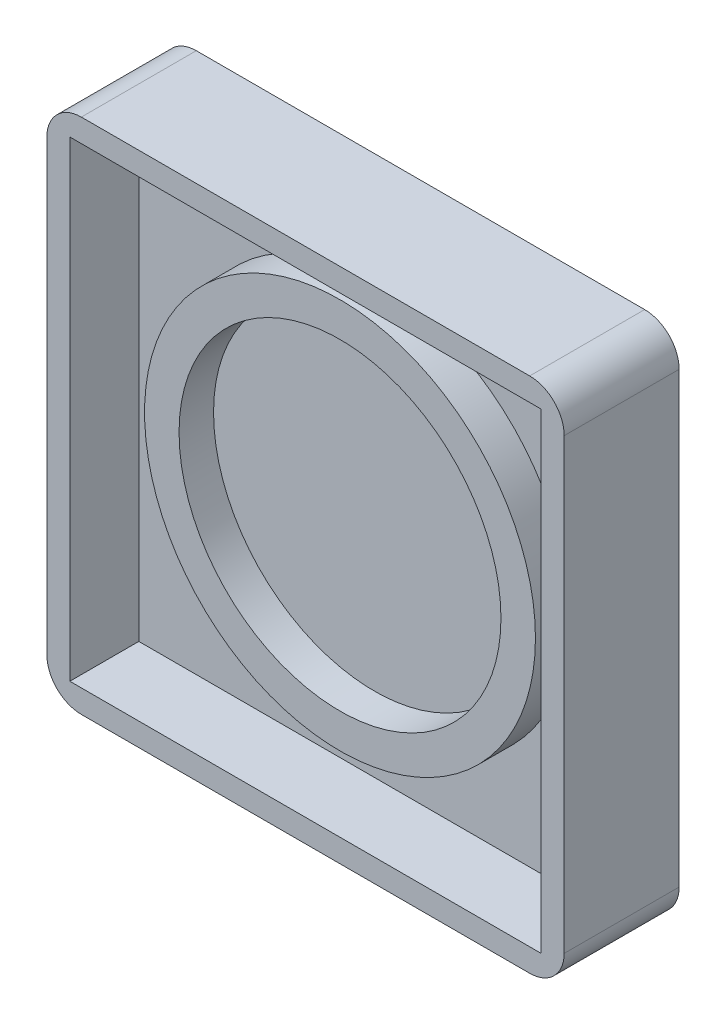
ISO-10303-21;
HEADER;
FILE_DESCRIPTION(('STEP AP214'),'2;1');
FILE_NAME('part.step','',(''),(''),'','','');
FILE_SCHEMA(('AUTOMOTIVE_DESIGN { 1 0 10303 214 1 1 1 1 }'));
ENDSEC;
DATA;
#1=APPLICATION_CONTEXT('core data for automotive mechanical design processes');
#2=APPLICATION_PROTOCOL_DEFINITION('international standard','automotive_design',2000,#1);
#3=PRODUCT_CONTEXT('',#1,'mechanical');
#4=PRODUCT('Part','Part','',(#3));
#5=PRODUCT_RELATED_PRODUCT_CATEGORY('part','',(#4));
#6=PRODUCT_DEFINITION_FORMATION('','',#4);
#7=PRODUCT_DEFINITION_CONTEXT('part definition',#1,'design');
#8=PRODUCT_DEFINITION('design','',#6,#7);
#9=PRODUCT_DEFINITION_SHAPE('','',#8);
#10=(LENGTH_UNIT() NAMED_UNIT(*) SI_UNIT(.MILLI.,.METRE.));
#11=(NAMED_UNIT(*) PLANE_ANGLE_UNIT() SI_UNIT($,.RADIAN.));
#12=(NAMED_UNIT(*) SI_UNIT($,.STERADIAN.) SOLID_ANGLE_UNIT());
#13=UNCERTAINTY_MEASURE_WITH_UNIT(LENGTH_MEASURE(1.E-05),#10,'distance_accuracy_value','');
#14=(GEOMETRIC_REPRESENTATION_CONTEXT(3) GLOBAL_UNCERTAINTY_ASSIGNED_CONTEXT((#13)) GLOBAL_UNIT_ASSIGNED_CONTEXT((#10,
#11,#12)) REPRESENTATION_CONTEXT('',''));
#15=CARTESIAN_POINT('',(0.,0.,0.));
#16=DIRECTION('',(0.,0.,1.));
#17=DIRECTION('',(1.,0.,0.));
#18=AXIS2_PLACEMENT_3D('',#15,#16,#17);
#19=CARTESIAN_POINT('',(-22.5,-22.5,10.));
#20=DIRECTION('',(1.,0.,0.));
#21=DIRECTION('',(0.,0.,-1.));
#22=AXIS2_PLACEMENT_3D('',#19,#20,#21);
#23=PLANE('',#22);
#24=DIRECTION('',(0.,-1.,0.));
#25=VECTOR('',#24,1.);
#26=CARTESIAN_POINT('',(-22.5,-22.5,0.));
#27=LINE('',#26,#25);
#28=CARTESIAN_POINT('',(-22.5,19.5,0.));
#29=VERTEX_POINT('',#28);
#30=CARTESIAN_POINT('',(-22.5,-19.5,0.));
#31=VERTEX_POINT('',#30);
#32=EDGE_CURVE('E165',#29,#31,#27,.T.);
#33=ORIENTED_EDGE('',*,*,#32,.T.);
#34=DIRECTION('',(0.,0.,-1.));
#35=VECTOR('',#34,1.);
#36=CARTESIAN_POINT('',(-22.5,-19.5,10.));
#37=LINE('',#36,#35);
#38=CARTESIAN_POINT('',(-22.5,-19.5,10.));
#39=VERTEX_POINT('',#38);
#40=EDGE_CURVE('E208',#31,#39,#37,.F.);
#41=ORIENTED_EDGE('',*,*,#40,.T.);
#42=DIRECTION('',(0.,-1.,0.));
#43=VECTOR('',#42,1.);
#44=CARTESIAN_POINT('',(-22.5,-22.5,10.));
#45=LINE('',#44,#43);
#46=CARTESIAN_POINT('',(-22.5,19.5,10.));
#47=VERTEX_POINT('',#46);
#48=EDGE_CURVE('E169',#47,#39,#45,.T.);
#49=ORIENTED_EDGE('',*,*,#48,.F.);
#50=DIRECTION('',(0.,0.,-1.));
#51=VECTOR('',#50,1.);
#52=CARTESIAN_POINT('',(-22.5,19.5,10.));
#53=LINE('',#52,#51);
#54=EDGE_CURVE('E205',#47,#29,#53,.T.);
#55=ORIENTED_EDGE('',*,*,#54,.T.);
#56=EDGE_LOOP('',(#33,#41,#49,#55));
#57=FACE_BOUND('',#56,.T.);
#58=ADVANCED_FACE('F33',(#57),#23,.F.);
#59=CARTESIAN_POINT('',(22.5,-22.5,10.));
#60=DIRECTION('',(0.,1.,0.));
#61=DIRECTION('',(-1.,0.,0.));
#62=AXIS2_PLACEMENT_3D('',#59,#60,#61);
#63=PLANE('',#62);
#64=DIRECTION('',(1.,0.,0.));
#65=VECTOR('',#64,1.);
#66=CARTESIAN_POINT('',(22.5,-22.5,10.));
#67=LINE('',#66,#65);
#68=CARTESIAN_POINT('',(-19.5,-22.5,10.));
#69=VERTEX_POINT('',#68);
#70=CARTESIAN_POINT('',(19.5,-22.5,10.));
#71=VERTEX_POINT('',#70);
#72=EDGE_CURVE('E172',#69,#71,#67,.T.);
#73=ORIENTED_EDGE('',*,*,#72,.F.);
#74=DIRECTION('',(0.,0.,-1.));
#75=VECTOR('',#74,1.);
#76=CARTESIAN_POINT('',(-19.5,-22.5,10.));
#77=LINE('',#76,#75);
#78=CARTESIAN_POINT('',(-19.5,-22.5,0.));
#79=VERTEX_POINT('',#78);
#80=EDGE_CURVE('E194',#69,#79,#77,.T.);
#81=ORIENTED_EDGE('',*,*,#80,.T.);
#82=DIRECTION('',(1.,0.,0.));
#83=VECTOR('',#82,1.);
#84=CARTESIAN_POINT('',(22.5,-22.5,0.));
#85=LINE('',#84,#83);
#86=CARTESIAN_POINT('',(19.5,-22.5,0.));
#87=VERTEX_POINT('',#86);
#88=EDGE_CURVE('E183',#79,#87,#85,.T.);
#89=ORIENTED_EDGE('',*,*,#88,.T.);
#90=DIRECTION('',(0.,0.,-1.));
#91=VECTOR('',#90,1.);
#92=CARTESIAN_POINT('',(19.5,-22.5,10.));
#93=LINE('',#92,#91);
#94=EDGE_CURVE('E192',#87,#71,#93,.F.);
#95=ORIENTED_EDGE('',*,*,#94,.T.);
#96=EDGE_LOOP('',(#73,#81,#89,#95));
#97=FACE_BOUND('',#96,.T.);
#98=ADVANCED_FACE('F245',(#97),#63,.F.);
#99=CARTESIAN_POINT('',(22.5,-22.5,10.));
#100=DIRECTION('',(-1.,0.,0.));
#101=DIRECTION('',(0.,0.,1.));
#102=AXIS2_PLACEMENT_3D('',#99,#100,#101);
#103=PLANE('',#102);
#104=DIRECTION('',(0.,1.,0.));
#105=VECTOR('',#104,1.);
#106=CARTESIAN_POINT('',(22.5,-22.5,10.));
#107=LINE('',#106,#105);
#108=CARTESIAN_POINT('',(22.5,-19.5,10.));
#109=VERTEX_POINT('',#108);
#110=CARTESIAN_POINT('',(22.5,19.5,10.));
#111=VERTEX_POINT('',#110);
#112=EDGE_CURVE('E176',#109,#111,#107,.T.);
#113=ORIENTED_EDGE('',*,*,#112,.F.);
#114=DIRECTION('',(0.,0.,-1.));
#115=VECTOR('',#114,1.);
#116=CARTESIAN_POINT('',(22.5,-19.5,10.));
#117=LINE('',#116,#115);
#118=CARTESIAN_POINT('',(22.5,-19.5,0.));
#119=VERTEX_POINT('',#118);
#120=EDGE_CURVE('E219',#109,#119,#117,.T.);
#121=ORIENTED_EDGE('',*,*,#120,.T.);
#122=DIRECTION('',(0.,1.,0.));
#123=VECTOR('',#122,1.);
#124=CARTESIAN_POINT('',(22.5,-22.5,0.));
#125=LINE('',#124,#123);
#126=CARTESIAN_POINT('',(22.5,19.5,0.));
#127=VERTEX_POINT('',#126);
#128=EDGE_CURVE('E186',#119,#127,#125,.T.);
#129=ORIENTED_EDGE('',*,*,#128,.T.);
#130=DIRECTION('',(0.,0.,-1.));
#131=VECTOR('',#130,1.);
#132=CARTESIAN_POINT('',(22.5,19.5,10.));
#133=LINE('',#132,#131);
#134=EDGE_CURVE('E217',#127,#111,#133,.F.);
#135=ORIENTED_EDGE('',*,*,#134,.T.);
#136=EDGE_LOOP('',(#113,#121,#129,#135));
#137=FACE_BOUND('',#136,.T.);
#138=ADVANCED_FACE('F253',(#137),#103,.F.);
#139=CARTESIAN_POINT('',(22.5,22.5,10.));
#140=DIRECTION('',(0.,-1.,0.));
#141=DIRECTION('',(1.,0.,0.));
#142=AXIS2_PLACEMENT_3D('',#139,#140,#141);
#143=PLANE('',#142);
#144=DIRECTION('',(-1.,0.,0.));
#145=VECTOR('',#144,1.);
#146=CARTESIAN_POINT('',(22.5,22.5,0.));
#147=LINE('',#146,#145);
#148=CARTESIAN_POINT('',(19.5,22.5,0.));
#149=VERTEX_POINT('',#148);
#150=CARTESIAN_POINT('',(-19.5,22.5,0.));
#151=VERTEX_POINT('',#150);
#152=EDGE_CURVE('E173',#149,#151,#147,.T.);
#153=ORIENTED_EDGE('',*,*,#152,.T.);
#154=DIRECTION('',(0.,0.,-1.));
#155=VECTOR('',#154,1.);
#156=CARTESIAN_POINT('',(-19.5,22.5,10.));
#157=LINE('',#156,#155);
#158=CARTESIAN_POINT('',(-19.5,22.5,10.));
#159=VERTEX_POINT('',#158);
#160=EDGE_CURVE('E11',#151,#159,#157,.F.);
#161=ORIENTED_EDGE('',*,*,#160,.T.);
#162=DIRECTION('',(-1.,0.,0.));
#163=VECTOR('',#162,1.);
#164=CARTESIAN_POINT('',(22.5,22.5,10.));
#165=LINE('',#164,#163);
#166=CARTESIAN_POINT('',(19.5,22.5,10.));
#167=VERTEX_POINT('',#166);
#168=EDGE_CURVE('E178',#167,#159,#165,.T.);
#169=ORIENTED_EDGE('',*,*,#168,.F.);
#170=DIRECTION('',(0.,0.,-1.));
#171=VECTOR('',#170,1.);
#172=CARTESIAN_POINT('',(19.5,22.5,10.));
#173=LINE('',#172,#171);
#174=EDGE_CURVE('E41',#167,#149,#173,.T.);
#175=ORIENTED_EDGE('',*,*,#174,.T.);
#176=EDGE_LOOP('',(#153,#161,#169,#175));
#177=FACE_BOUND('',#176,.T.);
#178=ADVANCED_FACE('F224',(#177),#143,.F.);
#179=CARTESIAN_POINT('',(0.,0.,10.));
#180=DIRECTION('',(0.,0.,1.));
#181=DIRECTION('',(1.,0.,0.));
#182=AXIS2_PLACEMENT_3D('',#179,#180,#181);
#183=PLANE('',#182);
#184=DIRECTION('',(0.,-1.,0.));
#185=VECTOR('',#184,1.);
#186=CARTESIAN_POINT('',(-20.5,-20.5,10.));
#187=LINE('',#186,#185);
#188=CARTESIAN_POINT('',(-20.5,20.5,10.));
#189=VERTEX_POINT('',#188);
#190=CARTESIAN_POINT('',(-20.5,-20.5,10.));
#191=VERTEX_POINT('',#190);
#192=EDGE_CURVE('E129',#189,#191,#187,.T.);
#193=ORIENTED_EDGE('',*,*,#192,.F.);
#194=DIRECTION('',(-1.,0.,0.));
#195=VECTOR('',#194,1.);
#196=CARTESIAN_POINT('',(20.5,20.5,10.));
#197=LINE('',#196,#195);
#198=CARTESIAN_POINT('',(20.5,20.5,10.));
#199=VERTEX_POINT('',#198);
#200=EDGE_CURVE('E146',#199,#189,#197,.T.);
#201=ORIENTED_EDGE('',*,*,#200,.F.);
#202=DIRECTION('',(0.,1.,0.));
#203=VECTOR('',#202,1.);
#204=CARTESIAN_POINT('',(20.5,-20.5,10.));
#205=LINE('',#204,#203);
#206=CARTESIAN_POINT('',(20.5,-20.5,10.));
#207=VERTEX_POINT('',#206);
#208=EDGE_CURVE('E149',#207,#199,#205,.T.);
#209=ORIENTED_EDGE('',*,*,#208,.F.);
#210=DIRECTION('',(1.,0.,0.));
#211=VECTOR('',#210,1.);
#212=CARTESIAN_POINT('',(20.5,-20.5,10.));
#213=LINE('',#212,#211);
#214=EDGE_CURVE('E158',#191,#207,#213,.T.);
#215=ORIENTED_EDGE('',*,*,#214,.F.);
#216=EDGE_LOOP('',(#193,#201,#209,#215));
#217=FACE_BOUND('',#216,.T.);
#218=ORIENTED_EDGE('',*,*,#48,.T.);
#219=CARTESIAN_POINT('',(-19.5,-19.5,10.));
#220=DIRECTION('',(0.,0.,1.));
#221=DIRECTION('',(1.,0.,0.));
#222=AXIS2_PLACEMENT_3D('',#219,#220,#221);
#223=CIRCLE('',#222,3.);
#224=EDGE_CURVE('E215',#39,#69,#223,.T.);
#225=ORIENTED_EDGE('',*,*,#224,.T.);
#226=ORIENTED_EDGE('',*,*,#72,.T.);
#227=CARTESIAN_POINT('',(19.5,-19.5,10.));
#228=DIRECTION('',(0.,0.,1.));
#229=DIRECTION('',(1.,0.,0.));
#230=AXIS2_PLACEMENT_3D('',#227,#228,#229);
#231=CIRCLE('',#230,3.);
#232=EDGE_CURVE('E213',#71,#109,#231,.T.);
#233=ORIENTED_EDGE('',*,*,#232,.T.);
#234=ORIENTED_EDGE('',*,*,#112,.T.);
#235=CARTESIAN_POINT('',(19.5,19.5,10.));
#236=DIRECTION('',(0.,0.,1.));
#237=DIRECTION('',(1.,0.,0.));
#238=AXIS2_PLACEMENT_3D('',#235,#236,#237);
#239=CIRCLE('',#238,3.);
#240=EDGE_CURVE('E53',#111,#167,#239,.T.);
#241=ORIENTED_EDGE('',*,*,#240,.T.);
#242=ORIENTED_EDGE('',*,*,#168,.T.);
#243=CARTESIAN_POINT('',(-19.5,19.5,10.));
#244=DIRECTION('',(0.,0.,1.));
#245=DIRECTION('',(1.,0.,0.));
#246=AXIS2_PLACEMENT_3D('',#243,#244,#245);
#247=CIRCLE('',#246,3.);
#248=EDGE_CURVE('E211',#159,#47,#247,.T.);
#249=ORIENTED_EDGE('',*,*,#248,.T.);
#250=EDGE_LOOP('',(#218,#225,#226,#233,#234,#241,#242,#249));
#251=FACE_BOUND('',#250,.T.);
#252=ADVANCED_FACE('F239',(#217,#251),#183,.T.);
#253=CARTESIAN_POINT('',(0.,0.,0.));
#254=DIRECTION('',(0.,0.,1.));
#255=DIRECTION('',(1.,0.,0.));
#256=AXIS2_PLACEMENT_3D('',#253,#254,#255);
#257=PLANE('',#256);
#258=ORIENTED_EDGE('',*,*,#88,.F.);
#259=CARTESIAN_POINT('',(-19.5,-19.5,0.));
#260=DIRECTION('',(0.,0.,1.));
#261=DIRECTION('',(1.,0.,0.));
#262=AXIS2_PLACEMENT_3D('',#259,#260,#261);
#263=CIRCLE('',#262,3.);
#264=EDGE_CURVE('E203',#79,#31,#263,.F.);
#265=ORIENTED_EDGE('',*,*,#264,.T.);
#266=ORIENTED_EDGE('',*,*,#32,.F.);
#267=CARTESIAN_POINT('',(-19.5,19.5,0.));
#268=DIRECTION('',(0.,0.,1.));
#269=DIRECTION('',(1.,0.,0.));
#270=AXIS2_PLACEMENT_3D('',#267,#268,#269);
#271=CIRCLE('',#270,3.);
#272=EDGE_CURVE('E199',#29,#151,#271,.F.);
#273=ORIENTED_EDGE('',*,*,#272,.T.);
#274=ORIENTED_EDGE('',*,*,#152,.F.);
#275=CARTESIAN_POINT('',(19.5,19.5,0.));
#276=DIRECTION('',(0.,0.,1.));
#277=DIRECTION('',(1.,0.,0.));
#278=AXIS2_PLACEMENT_3D('',#275,#276,#277);
#279=CIRCLE('',#278,3.);
#280=EDGE_CURVE('E197',#149,#127,#279,.F.);
#281=ORIENTED_EDGE('',*,*,#280,.T.);
#282=ORIENTED_EDGE('',*,*,#128,.F.);
#283=CARTESIAN_POINT('',(19.5,-19.5,0.));
#284=DIRECTION('',(0.,0.,1.));
#285=DIRECTION('',(1.,0.,0.));
#286=AXIS2_PLACEMENT_3D('',#283,#284,#285);
#287=CIRCLE('',#286,3.);
#288=EDGE_CURVE('E201',#119,#87,#287,.F.);
#289=ORIENTED_EDGE('',*,*,#288,.T.);
#290=EDGE_LOOP('',(#258,#265,#266,#273,#274,#281,#282,#289));
#291=FACE_BOUND('',#290,.T.);
#292=ADVANCED_FACE('F228',(#291),#257,.F.);
#293=CARTESIAN_POINT('',(-20.5,-20.5,4.));
#294=DIRECTION('',(-1.,0.,0.));
#295=DIRECTION('',(0.,0.,1.));
#296=AXIS2_PLACEMENT_3D('',#293,#294,#295);
#297=PLANE('',#296);
#298=ORIENTED_EDGE('',*,*,#192,.T.);
#299=DIRECTION('',(0.,0.,1.));
#300=VECTOR('',#299,1.);
#301=CARTESIAN_POINT('',(-20.5,-20.5,4.));
#302=LINE('',#301,#300);
#303=CARTESIAN_POINT('',(-20.5,-20.5,4.));
#304=VERTEX_POINT('',#303);
#305=EDGE_CURVE('E122',#304,#191,#302,.T.);
#306=ORIENTED_EDGE('',*,*,#305,.F.);
#307=DIRECTION('',(0.,-1.,0.));
#308=VECTOR('',#307,1.);
#309=CARTESIAN_POINT('',(-20.5,-20.5,4.));
#310=LINE('',#309,#308);
#311=CARTESIAN_POINT('',(-20.5,20.5,4.));
#312=VERTEX_POINT('',#311);
#313=EDGE_CURVE('E126',#312,#304,#310,.T.);
#314=ORIENTED_EDGE('',*,*,#313,.F.);
#315=DIRECTION('',(0.,0.,1.));
#316=VECTOR('',#315,1.);
#317=CARTESIAN_POINT('',(-20.5,20.5,4.));
#318=LINE('',#317,#316);
#319=EDGE_CURVE('E163',#312,#189,#318,.T.);
#320=ORIENTED_EDGE('',*,*,#319,.T.);
#321=EDGE_LOOP('',(#298,#306,#314,#320));
#322=FACE_BOUND('',#321,.T.);
#323=ADVANCED_FACE('F124',(#322),#297,.F.);
#324=CARTESIAN_POINT('',(20.5,20.5,4.));
#325=DIRECTION('',(0.,1.,0.));
#326=DIRECTION('',(-1.,0.,0.));
#327=AXIS2_PLACEMENT_3D('',#324,#325,#326);
#328=PLANE('',#327);
#329=ORIENTED_EDGE('',*,*,#200,.T.);
#330=ORIENTED_EDGE('',*,*,#319,.F.);
#331=DIRECTION('',(-1.,0.,0.));
#332=VECTOR('',#331,1.);
#333=CARTESIAN_POINT('',(20.5,20.5,4.));
#334=LINE('',#333,#332);
#335=CARTESIAN_POINT('',(20.5,20.5,4.));
#336=VERTEX_POINT('',#335);
#337=EDGE_CURVE('E134',#336,#312,#334,.T.);
#338=ORIENTED_EDGE('',*,*,#337,.F.);
#339=DIRECTION('',(0.,0.,1.));
#340=VECTOR('',#339,1.);
#341=CARTESIAN_POINT('',(20.5,20.5,4.));
#342=LINE('',#341,#340);
#343=EDGE_CURVE('E166',#336,#199,#342,.T.);
#344=ORIENTED_EDGE('',*,*,#343,.T.);
#345=EDGE_LOOP('',(#329,#330,#338,#344));
#346=FACE_BOUND('',#345,.T.);
#347=ADVANCED_FACE('F350',(#346),#328,.F.);
#348=CARTESIAN_POINT('',(20.5,-20.5,4.));
#349=DIRECTION('',(1.,0.,0.));
#350=DIRECTION('',(0.,0.,-1.));
#351=AXIS2_PLACEMENT_3D('',#348,#349,#350);
#352=PLANE('',#351);
#353=ORIENTED_EDGE('',*,*,#208,.T.);
#354=ORIENTED_EDGE('',*,*,#343,.F.);
#355=DIRECTION('',(0.,1.,0.));
#356=VECTOR('',#355,1.);
#357=CARTESIAN_POINT('',(20.5,-20.5,4.));
#358=LINE('',#357,#356);
#359=CARTESIAN_POINT('',(20.5,-20.5,4.));
#360=VERTEX_POINT('',#359);
#361=EDGE_CURVE('E142',#360,#336,#358,.T.);
#362=ORIENTED_EDGE('',*,*,#361,.F.);
#363=DIRECTION('',(0.,0.,1.));
#364=VECTOR('',#363,1.);
#365=CARTESIAN_POINT('',(20.5,-20.5,4.));
#366=LINE('',#365,#364);
#367=EDGE_CURVE('E133',#360,#207,#366,.T.);
#368=ORIENTED_EDGE('',*,*,#367,.T.);
#369=EDGE_LOOP('',(#353,#354,#362,#368));
#370=FACE_BOUND('',#369,.T.);
#371=ADVANCED_FACE('F342',(#370),#352,.F.);
#372=CARTESIAN_POINT('',(20.5,-20.5,4.));
#373=DIRECTION('',(0.,-1.,0.));
#374=DIRECTION('',(1.,0.,0.));
#375=AXIS2_PLACEMENT_3D('',#372,#373,#374);
#376=PLANE('',#375);
#377=ORIENTED_EDGE('',*,*,#214,.T.);
#378=ORIENTED_EDGE('',*,*,#367,.F.);
#379=DIRECTION('',(1.,0.,0.));
#380=VECTOR('',#379,1.);
#381=CARTESIAN_POINT('',(20.5,-20.5,4.));
#382=LINE('',#381,#380);
#383=EDGE_CURVE('E137',#304,#360,#382,.T.);
#384=ORIENTED_EDGE('',*,*,#383,.F.);
#385=ORIENTED_EDGE('',*,*,#305,.T.);
#386=EDGE_LOOP('',(#377,#378,#384,#385));
#387=FACE_BOUND('',#386,.T.);
#388=ADVANCED_FACE('F138',(#387),#376,.F.);
#389=CARTESIAN_POINT('',(0.,0.,4.));
#390=DIRECTION('',(0.,0.,1.));
#391=DIRECTION('',(1.,0.,0.));
#392=AXIS2_PLACEMENT_3D('',#389,#390,#391);
#393=PLANE('',#392);
#394=CARTESIAN_POINT('',(0.,0.,4.));
#395=DIRECTION('',(0.,0.,1.));
#396=DIRECTION('',(1.,0.,0.));
#397=AXIS2_PLACEMENT_3D('',#394,#395,#396);
#398=CIRCLE('',#397,17.);
#399=CARTESIAN_POINT('',(17.,0.,4.));
#400=VERTEX_POINT('',#399);
#401=EDGE_CURVE('E152',#400,#400,#398,.T.);
#402=ORIENTED_EDGE('',*,*,#401,.F.);
#403=EDGE_LOOP('',(#402));
#404=FACE_BOUND('',#403,.T.);
#405=ORIENTED_EDGE('',*,*,#313,.T.);
#406=ORIENTED_EDGE('',*,*,#383,.T.);
#407=ORIENTED_EDGE('',*,*,#361,.T.);
#408=ORIENTED_EDGE('',*,*,#337,.T.);
#409=EDGE_LOOP('',(#405,#406,#407,#408));
#410=FACE_BOUND('',#409,.T.);
#411=ADVANCED_FACE('F144',(#404,#410),#393,.T.);
#412=CARTESIAN_POINT('',(0.,0.,7.));
#413=DIRECTION('',(0.,0.,1.));
#414=DIRECTION('',(1.,0.,0.));
#415=AXIS2_PLACEMENT_3D('',#412,#413,#414);
#416=PLANE('',#415);
#417=CARTESIAN_POINT('',(0.,0.,7.));
#418=DIRECTION('',(0.,0.,1.));
#419=DIRECTION('',(1.,0.,0.));
#420=AXIS2_PLACEMENT_3D('',#417,#418,#419);
#421=CIRCLE('',#420,17.);
#422=CARTESIAN_POINT('',(17.,0.,7.));
#423=VERTEX_POINT('',#422);
#424=EDGE_CURVE('E159',#423,#423,#421,.T.);
#425=ORIENTED_EDGE('',*,*,#424,.T.);
#426=EDGE_LOOP('',(#425));
#427=FACE_BOUND('',#426,.T.);
#428=CARTESIAN_POINT('',(0.,0.,7.));
#429=DIRECTION('',(0.,0.,1.));
#430=DIRECTION('',(1.,0.,0.));
#431=AXIS2_PLACEMENT_3D('',#428,#429,#430);
#432=CIRCLE('',#431,14.);
#433=CARTESIAN_POINT('',(14.,0.,7.));
#434=VERTEX_POINT('',#433);
#435=EDGE_CURVE('E423',#434,#434,#432,.T.);
#436=ORIENTED_EDGE('',*,*,#435,.F.);
#437=EDGE_LOOP('',(#436));
#438=FACE_BOUND('',#437,.T.);
#439=ADVANCED_FACE('F312',(#427,#438),#416,.T.);
#440=CARTESIAN_POINT('',(0.,0.,7.));
#441=DIRECTION('',(0.,0.,-1.));
#442=DIRECTION('',(-1.,0.,0.));
#443=AXIS2_PLACEMENT_3D('',#440,#441,#442);
#444=CYLINDRICAL_SURFACE('',#443,17.);
#445=ORIENTED_EDGE('',*,*,#424,.F.);
#446=EDGE_LOOP('',(#445));
#447=FACE_BOUND('',#446,.T.);
#448=ORIENTED_EDGE('',*,*,#401,.T.);
#449=EDGE_LOOP('',(#448));
#450=FACE_BOUND('',#449,.T.);
#451=ADVANCED_FACE('F303',(#447,#450),#444,.T.);
#452=CARTESIAN_POINT('',(0.,0.,7.));
#453=DIRECTION('',(0.,0.,-1.));
#454=DIRECTION('',(-1.,0.,0.));
#455=AXIS2_PLACEMENT_3D('',#452,#453,#454);
#456=CYLINDRICAL_SURFACE('',#455,14.);
#457=ORIENTED_EDGE('',*,*,#435,.T.);
#458=EDGE_LOOP('',(#457));
#459=FACE_BOUND('',#458,.T.);
#460=CARTESIAN_POINT('',(0.,0.,4.));
#461=DIRECTION('',(0.,0.,1.));
#462=DIRECTION('',(1.,0.,0.));
#463=AXIS2_PLACEMENT_3D('',#460,#461,#462);
#464=CIRCLE('',#463,14.);
#465=CARTESIAN_POINT('',(14.,0.,4.));
#466=VERTEX_POINT('',#465);
#467=EDGE_CURVE('E180',#466,#466,#464,.F.);
#468=ORIENTED_EDGE('',*,*,#467,.T.);
#469=EDGE_LOOP('',(#468));
#470=FACE_BOUND('',#469,.T.);
#471=ADVANCED_FACE('F297',(#459,#470),#456,.F.);
#472=ORIENTED_EDGE('',*,*,#467,.F.);
#473=EDGE_LOOP('',(#472));
#474=FACE_BOUND('',#473,.T.);
#475=ADVANCED_FACE('F270',(#474),#393,.T.);
#476=CARTESIAN_POINT('',(-19.5,-19.5,10.));
#477=DIRECTION('',(0.,0.,-1.));
#478=DIRECTION('',(-1.,0.,0.));
#479=AXIS2_PLACEMENT_3D('',#476,#477,#478);
#480=CYLINDRICAL_SURFACE('',#479,3.);
#481=ORIENTED_EDGE('',*,*,#224,.F.);
#482=ORIENTED_EDGE('',*,*,#40,.F.);
#483=ORIENTED_EDGE('',*,*,#264,.F.);
#484=ORIENTED_EDGE('',*,*,#80,.F.);
#485=EDGE_LOOP('',(#481,#482,#483,#484));
#486=FACE_BOUND('',#485,.T.);
#487=ADVANCED_FACE('F243',(#486),#480,.T.);
#488=CARTESIAN_POINT('',(19.5,-19.5,10.));
#489=DIRECTION('',(0.,0.,-1.));
#490=DIRECTION('',(-1.,0.,0.));
#491=AXIS2_PLACEMENT_3D('',#488,#489,#490);
#492=CYLINDRICAL_SURFACE('',#491,3.);
#493=ORIENTED_EDGE('',*,*,#232,.F.);
#494=ORIENTED_EDGE('',*,*,#94,.F.);
#495=ORIENTED_EDGE('',*,*,#288,.F.);
#496=ORIENTED_EDGE('',*,*,#120,.F.);
#497=EDGE_LOOP('',(#493,#494,#495,#496));
#498=FACE_BOUND('',#497,.T.);
#499=ADVANCED_FACE('F250',(#498),#492,.T.);
#500=CARTESIAN_POINT('',(-19.5,19.5,10.));
#501=DIRECTION('',(0.,0.,-1.));
#502=DIRECTION('',(-1.,0.,0.));
#503=AXIS2_PLACEMENT_3D('',#500,#501,#502);
#504=CYLINDRICAL_SURFACE('',#503,3.);
#505=ORIENTED_EDGE('',*,*,#248,.F.);
#506=ORIENTED_EDGE('',*,*,#160,.F.);
#507=ORIENTED_EDGE('',*,*,#272,.F.);
#508=ORIENTED_EDGE('',*,*,#54,.F.);
#509=EDGE_LOOP('',(#505,#506,#507,#508));
#510=FACE_BOUND('',#509,.T.);
#511=ADVANCED_FACE('F234',(#510),#504,.T.);
#512=CARTESIAN_POINT('',(19.5,19.5,10.));
#513=DIRECTION('',(0.,0.,-1.));
#514=DIRECTION('',(-1.,0.,0.));
#515=AXIS2_PLACEMENT_3D('',#512,#513,#514);
#516=CYLINDRICAL_SURFACE('',#515,3.);
#517=ORIENTED_EDGE('',*,*,#240,.F.);
#518=ORIENTED_EDGE('',*,*,#134,.F.);
#519=ORIENTED_EDGE('',*,*,#280,.F.);
#520=ORIENTED_EDGE('',*,*,#174,.F.);
#521=EDGE_LOOP('',(#517,#518,#519,#520));
#522=FACE_BOUND('',#521,.T.);
#523=ADVANCED_FACE('F35',(#522),#516,.T.);
#524=CLOSED_SHELL('',(#58,#98,#138,#178,#252,#292,#323,#347,#371,#388,#411,#439,#451,#471,#475,
#487,#499,#511,#523));
#525=MANIFOLD_SOLID_BREP('B2',#524);
#526=ADVANCED_BREP_SHAPE_REPRESENTATION('',(#18,#525),#14);
#527=SHAPE_DEFINITION_REPRESENTATION(#9,#526);
ENDSEC;
END-ISO-10303-21;
